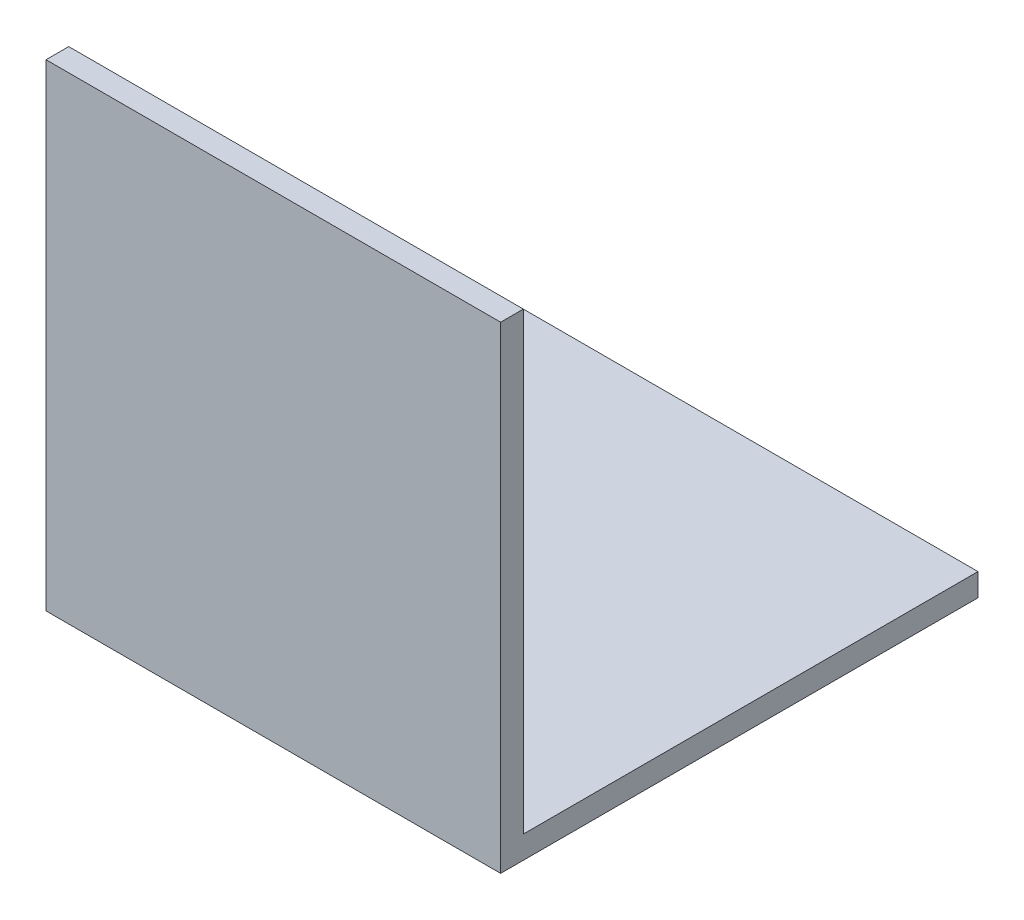
ISO-10303-21;
HEADER;
FILE_DESCRIPTION(('STEP AP214'),'2;1');
FILE_NAME('part.step','',(''),(''),'','','');
FILE_SCHEMA(('AUTOMOTIVE_DESIGN { 1 0 10303 214 1 1 1 1 }'));
ENDSEC;
DATA;
#1=APPLICATION_CONTEXT('core data for automotive mechanical design processes');
#2=APPLICATION_PROTOCOL_DEFINITION('international standard','automotive_design',2000,#1);
#3=PRODUCT_CONTEXT('',#1,'mechanical');
#4=PRODUCT('Part','Part','',(#3));
#5=PRODUCT_RELATED_PRODUCT_CATEGORY('part','',(#4));
#6=PRODUCT_DEFINITION_FORMATION('','',#4);
#7=PRODUCT_DEFINITION_CONTEXT('part definition',#1,'design');
#8=PRODUCT_DEFINITION('design','',#6,#7);
#9=PRODUCT_DEFINITION_SHAPE('','',#8);
#10=(LENGTH_UNIT() NAMED_UNIT(*) SI_UNIT(.MILLI.,.METRE.));
#11=(NAMED_UNIT(*) PLANE_ANGLE_UNIT() SI_UNIT($,.RADIAN.));
#12=(NAMED_UNIT(*) SI_UNIT($,.STERADIAN.) SOLID_ANGLE_UNIT());
#13=UNCERTAINTY_MEASURE_WITH_UNIT(LENGTH_MEASURE(1.E-05),#10,'distance_accuracy_value','');
#14=(GEOMETRIC_REPRESENTATION_CONTEXT(3) GLOBAL_UNCERTAINTY_ASSIGNED_CONTEXT((#13)) GLOBAL_UNIT_ASSIGNED_CONTEXT((#10,
#11,#12)) REPRESENTATION_CONTEXT('',''));
#15=CARTESIAN_POINT('',(0.,0.,0.));
#16=DIRECTION('',(0.,0.,1.));
#17=DIRECTION('',(1.,0.,0.));
#18=AXIS2_PLACEMENT_3D('',#15,#16,#17);
#19=CARTESIAN_POINT('',(1000.,100.,-779.728033543879));
#20=DIRECTION('',(-1.,0.,0.));
#21=DIRECTION('',(0.,0.,1.));
#22=AXIS2_PLACEMENT_3D('',#19,#20,#21);
#23=PLANE('',#22);
#24=DIRECTION('',(0.,0.,-1.));
#25=VECTOR('',#24,1.);
#26=CARTESIAN_POINT('',(1000.,0.,-779.728033543879));
#27=LINE('',#26,#25);
#28=CARTESIAN_POINT('',(1000.,0.,1320.27196645612));
#29=VERTEX_POINT('',#28);
#30=CARTESIAN_POINT('',(1000.,0.,-779.728033543879));
#31=VERTEX_POINT('',#30);
#32=EDGE_CURVE('E95',#29,#31,#27,.T.);
#33=ORIENTED_EDGE('',*,*,#32,.T.);
#34=DIRECTION('',(0.,-1.,0.));
#35=VECTOR('',#34,1.);
#36=CARTESIAN_POINT('',(1000.,100.,-779.728033543879));
#37=LINE('',#36,#35);
#38=CARTESIAN_POINT('',(1000.,100.,-779.728033543879));
#39=VERTEX_POINT('',#38);
#40=EDGE_CURVE('E11',#39,#31,#37,.T.);
#41=ORIENTED_EDGE('',*,*,#40,.F.);
#42=DIRECTION('',(0.,0.,-1.));
#43=VECTOR('',#42,1.);
#44=CARTESIAN_POINT('',(1000.,100.,-779.728033543879));
#45=LINE('',#44,#43);
#46=CARTESIAN_POINT('',(1000.,100.,1220.27196645612));
#47=VERTEX_POINT('',#46);
#48=EDGE_CURVE('E87',#47,#39,#45,.T.);
#49=ORIENTED_EDGE('',*,*,#48,.F.);
#50=DIRECTION('',(0.,1.,0.));
#51=VECTOR('',#50,1.);
#52=CARTESIAN_POINT('',(1000.,0.,1220.27196645612));
#53=LINE('',#52,#51);
#54=CARTESIAN_POINT('',(1000.,2100.,1220.27196645612));
#55=VERTEX_POINT('',#54);
#56=EDGE_CURVE('E49',#47,#55,#53,.T.);
#57=ORIENTED_EDGE('',*,*,#56,.T.);
#58=DIRECTION('',(0.,0.,-1.));
#59=VECTOR('',#58,1.);
#60=CARTESIAN_POINT('',(1000.,2100.,1320.27196645612));
#61=LINE('',#60,#59);
#62=CARTESIAN_POINT('',(1000.,2100.,1320.27196645612));
#63=VERTEX_POINT('',#62);
#64=EDGE_CURVE('E102',#63,#55,#61,.T.);
#65=ORIENTED_EDGE('',*,*,#64,.F.);
#66=DIRECTION('',(0.,1.,0.));
#67=VECTOR('',#66,1.);
#68=CARTESIAN_POINT('',(1000.,0.,1320.27196645612));
#69=LINE('',#68,#67);
#70=EDGE_CURVE('E99',#29,#63,#69,.T.);
#71=ORIENTED_EDGE('',*,*,#70,.F.);
#72=EDGE_LOOP('',(#33,#41,#49,#57,#65,#71));
#73=FACE_BOUND('',#72,.T.);
#74=ADVANCED_FACE('F33',(#73),#23,.F.);
#75=CARTESIAN_POINT('',(-1000.,100.,-779.728033543879));
#76=DIRECTION('',(0.,0.,1.));
#77=DIRECTION('',(1.,0.,0.));
#78=AXIS2_PLACEMENT_3D('',#75,#76,#77);
#79=PLANE('',#78);
#80=DIRECTION('',(-1.,0.,0.));
#81=VECTOR('',#80,1.);
#82=CARTESIAN_POINT('',(-1000.,0.,-779.728033543879));
#83=LINE('',#82,#81);
#84=CARTESIAN_POINT('',(-1000.,0.,-779.728033543879));
#85=VERTEX_POINT('',#84);
#86=EDGE_CURVE('E62',#31,#85,#83,.T.);
#87=ORIENTED_EDGE('',*,*,#86,.T.);
#88=DIRECTION('',(0.,-1.,0.));
#89=VECTOR('',#88,1.);
#90=CARTESIAN_POINT('',(-1000.,100.,-779.728033543879));
#91=LINE('',#90,#89);
#92=CARTESIAN_POINT('',(-1000.,100.,-779.728033543879));
#93=VERTEX_POINT('',#92);
#94=EDGE_CURVE('E41',#93,#85,#91,.T.);
#95=ORIENTED_EDGE('',*,*,#94,.F.);
#96=DIRECTION('',(-1.,0.,0.));
#97=VECTOR('',#96,1.);
#98=CARTESIAN_POINT('',(-1000.,100.,-779.728033543879));
#99=LINE('',#98,#97);
#100=EDGE_CURVE('E77',#39,#93,#99,.T.);
#101=ORIENTED_EDGE('',*,*,#100,.F.);
#102=ORIENTED_EDGE('',*,*,#40,.T.);
#103=EDGE_LOOP('',(#87,#95,#101,#102));
#104=FACE_BOUND('',#103,.T.);
#105=ADVANCED_FACE('F79',(#104),#79,.F.);
#106=CARTESIAN_POINT('',(-1000.,100.,-779.728033543879));
#107=DIRECTION('',(1.,0.,0.));
#108=DIRECTION('',(0.,0.,-1.));
#109=AXIS2_PLACEMENT_3D('',#106,#107,#108);
#110=PLANE('',#109);
#111=DIRECTION('',(0.,0.,1.));
#112=VECTOR('',#111,1.);
#113=CARTESIAN_POINT('',(-1000.,0.,-779.728033543879));
#114=LINE('',#113,#112);
#115=CARTESIAN_POINT('',(-1000.,0.,1320.27196645612));
#116=VERTEX_POINT('',#115);
#117=EDGE_CURVE('E92',#85,#116,#114,.T.);
#118=ORIENTED_EDGE('',*,*,#117,.T.);
#119=DIRECTION('',(0.,-1.,0.));
#120=VECTOR('',#119,1.);
#121=CARTESIAN_POINT('',(-1000.,0.,1320.27196645612));
#122=LINE('',#121,#120);
#123=CARTESIAN_POINT('',(-1000.,2100.,1320.27196645612));
#124=VERTEX_POINT('',#123);
#125=EDGE_CURVE('E120',#124,#116,#122,.T.);
#126=ORIENTED_EDGE('',*,*,#125,.F.);
#127=DIRECTION('',(0.,0.,-1.));
#128=VECTOR('',#127,1.);
#129=CARTESIAN_POINT('',(-1000.,2100.,1320.27196645612));
#130=LINE('',#129,#128);
#131=CARTESIAN_POINT('',(-1000.,2100.,1220.27196645612));
#132=VERTEX_POINT('',#131);
#133=EDGE_CURVE('E106',#124,#132,#130,.T.);
#134=ORIENTED_EDGE('',*,*,#133,.T.);
#135=DIRECTION('',(0.,-1.,0.));
#136=VECTOR('',#135,1.);
#137=CARTESIAN_POINT('',(-1000.,0.,1220.27196645612));
#138=LINE('',#137,#136);
#139=CARTESIAN_POINT('',(-1000.,100.,1220.27196645612));
#140=VERTEX_POINT('',#139);
#141=EDGE_CURVE('E122',#132,#140,#138,.T.);
#142=ORIENTED_EDGE('',*,*,#141,.T.);
#143=DIRECTION('',(0.,0.,1.));
#144=VECTOR('',#143,1.);
#145=CARTESIAN_POINT('',(-1000.,100.,-779.728033543879));
#146=LINE('',#145,#144);
#147=EDGE_CURVE('E86',#93,#140,#146,.T.);
#148=ORIENTED_EDGE('',*,*,#147,.F.);
#149=ORIENTED_EDGE('',*,*,#94,.T.);
#150=EDGE_LOOP('',(#118,#126,#134,#142,#148,#149));
#151=FACE_BOUND('',#150,.T.);
#152=ADVANCED_FACE('F136',(#151),#110,.F.);
#153=CARTESIAN_POINT('',(0.,100.,0.));
#154=DIRECTION('',(0.,1.,0.));
#155=DIRECTION('',(0.,0.,1.));
#156=AXIS2_PLACEMENT_3D('',#153,#154,#155);
#157=PLANE('',#156);
#158=ORIENTED_EDGE('',*,*,#48,.T.);
#159=ORIENTED_EDGE('',*,*,#100,.T.);
#160=ORIENTED_EDGE('',*,*,#147,.T.);
#161=DIRECTION('',(1.,0.,0.));
#162=VECTOR('',#161,1.);
#163=CARTESIAN_POINT('',(-1000.,100.,1220.27196645612));
#164=LINE('',#163,#162);
#165=EDGE_CURVE('E66',#140,#47,#164,.T.);
#166=ORIENTED_EDGE('',*,*,#165,.T.);
#167=EDGE_LOOP('',(#158,#159,#160,#166));
#168=FACE_BOUND('',#167,.T.);
#169=ADVANCED_FACE('F90',(#168),#157,.T.);
#170=CARTESIAN_POINT('',(0.,0.,0.));
#171=DIRECTION('',(0.,1.,0.));
#172=DIRECTION('',(0.,0.,1.));
#173=AXIS2_PLACEMENT_3D('',#170,#171,#172);
#174=PLANE('',#173);
#175=ORIENTED_EDGE('',*,*,#32,.F.);
#176=DIRECTION('',(1.,0.,0.));
#177=VECTOR('',#176,1.);
#178=CARTESIAN_POINT('',(-1000.,0.,1320.27196645612));
#179=LINE('',#178,#177);
#180=EDGE_CURVE('E126',#116,#29,#179,.T.);
#181=ORIENTED_EDGE('',*,*,#180,.F.);
#182=ORIENTED_EDGE('',*,*,#117,.F.);
#183=ORIENTED_EDGE('',*,*,#86,.F.);
#184=EDGE_LOOP('',(#175,#181,#182,#183));
#185=FACE_BOUND('',#184,.T.);
#186=ADVANCED_FACE('F137',(#185),#174,.F.);
#187=CARTESIAN_POINT('',(0.,0.,1220.27196645612));
#188=DIRECTION('',(0.,0.,-1.));
#189=DIRECTION('',(-1.,0.,0.));
#190=AXIS2_PLACEMENT_3D('',#187,#188,#189);
#191=PLANE('',#190);
#192=ORIENTED_EDGE('',*,*,#165,.F.);
#193=ORIENTED_EDGE('',*,*,#141,.F.);
#194=DIRECTION('',(-1.,0.,0.));
#195=VECTOR('',#194,1.);
#196=CARTESIAN_POINT('',(-1000.,2100.,1220.27196645612));
#197=LINE('',#196,#195);
#198=EDGE_CURVE('E117',#55,#132,#197,.T.);
#199=ORIENTED_EDGE('',*,*,#198,.F.);
#200=ORIENTED_EDGE('',*,*,#56,.F.);
#201=EDGE_LOOP('',(#192,#193,#199,#200));
#202=FACE_BOUND('',#201,.T.);
#203=ADVANCED_FACE('F139',(#202),#191,.T.);
#204=CARTESIAN_POINT('',(-1000.,2100.,1320.27196645612));
#205=DIRECTION('',(0.,-1.,0.));
#206=DIRECTION('',(0.,0.,-1.));
#207=AXIS2_PLACEMENT_3D('',#204,#205,#206);
#208=PLANE('',#207);
#209=ORIENTED_EDGE('',*,*,#198,.T.);
#210=ORIENTED_EDGE('',*,*,#133,.F.);
#211=DIRECTION('',(-1.,0.,0.));
#212=VECTOR('',#211,1.);
#213=CARTESIAN_POINT('',(-1000.,2100.,1320.27196645612));
#214=LINE('',#213,#212);
#215=EDGE_CURVE('E116',#63,#124,#214,.T.);
#216=ORIENTED_EDGE('',*,*,#215,.F.);
#217=ORIENTED_EDGE('',*,*,#64,.T.);
#218=EDGE_LOOP('',(#209,#210,#216,#217));
#219=FACE_BOUND('',#218,.T.);
#220=ADVANCED_FACE('F145',(#219),#208,.F.);
#221=CARTESIAN_POINT('',(0.,0.,1320.27196645612));
#222=DIRECTION('',(0.,0.,-1.));
#223=DIRECTION('',(-1.,0.,0.));
#224=AXIS2_PLACEMENT_3D('',#221,#222,#223);
#225=PLANE('',#224);
#226=ORIENTED_EDGE('',*,*,#125,.T.);
#227=ORIENTED_EDGE('',*,*,#180,.T.);
#228=ORIENTED_EDGE('',*,*,#70,.T.);
#229=ORIENTED_EDGE('',*,*,#215,.T.);
#230=EDGE_LOOP('',(#226,#227,#228,#229));
#231=FACE_BOUND('',#230,.T.);
#232=ADVANCED_FACE('F132',(#231),#225,.F.);
#233=CLOSED_SHELL('',(#74,#105,#152,#169,#186,#203,#220,#232));
#234=MANIFOLD_SOLID_BREP('B2',#233);
#235=ADVANCED_BREP_SHAPE_REPRESENTATION('',(#18,#234),#14);
#236=SHAPE_DEFINITION_REPRESENTATION(#9,#235);
ENDSEC;
END-ISO-10303-21;
